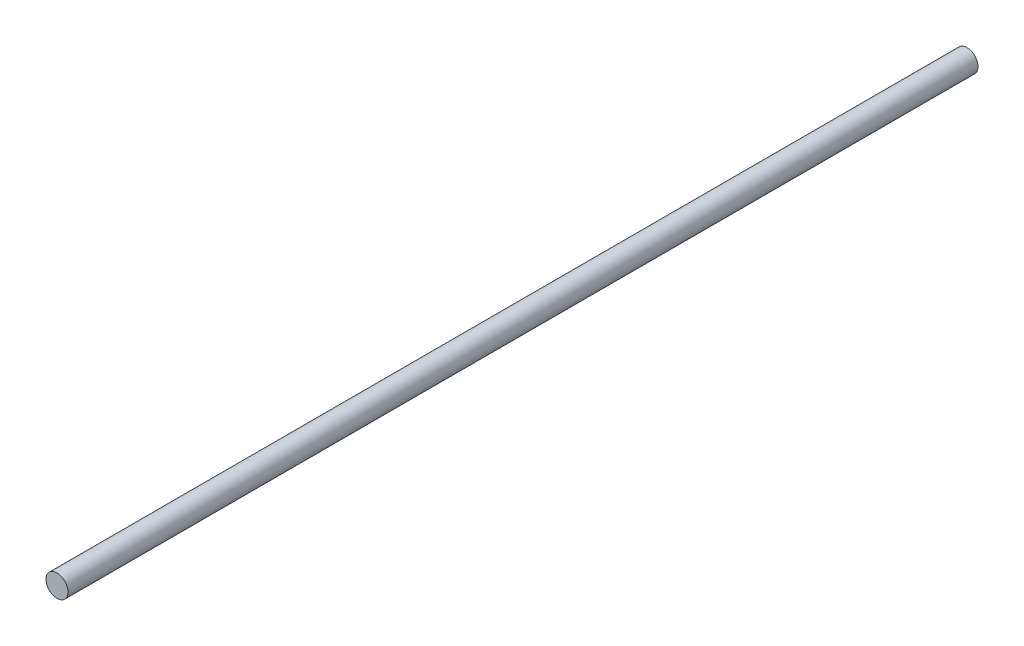
ISO-10303-21;
HEADER;
FILE_DESCRIPTION(('STEP AP214'),'2;1');
FILE_NAME('part.step','',(''),(''),'','','');
FILE_SCHEMA(('AUTOMOTIVE_DESIGN { 1 0 10303 214 1 1 1 1 }'));
ENDSEC;
DATA;
#1=APPLICATION_CONTEXT('core data for automotive mechanical design processes');
#2=APPLICATION_PROTOCOL_DEFINITION('international standard','automotive_design',2000,#1);
#3=PRODUCT_CONTEXT('',#1,'mechanical');
#4=PRODUCT('Part','Part','',(#3));
#5=PRODUCT_RELATED_PRODUCT_CATEGORY('part','',(#4));
#6=PRODUCT_DEFINITION_FORMATION('','',#4);
#7=PRODUCT_DEFINITION_CONTEXT('part definition',#1,'design');
#8=PRODUCT_DEFINITION('design','',#6,#7);
#9=PRODUCT_DEFINITION_SHAPE('','',#8);
#10=(LENGTH_UNIT() NAMED_UNIT(*) SI_UNIT(.MILLI.,.METRE.));
#11=(NAMED_UNIT(*) PLANE_ANGLE_UNIT() SI_UNIT($,.RADIAN.));
#12=(NAMED_UNIT(*) SI_UNIT($,.STERADIAN.) SOLID_ANGLE_UNIT());
#13=UNCERTAINTY_MEASURE_WITH_UNIT(LENGTH_MEASURE(1.E-05),#10,'distance_accuracy_value','');
#14=(GEOMETRIC_REPRESENTATION_CONTEXT(3) GLOBAL_UNCERTAINTY_ASSIGNED_CONTEXT((#13)) GLOBAL_UNIT_ASSIGNED_CONTEXT((#10,
#11,#12)) REPRESENTATION_CONTEXT('',''));
#15=CARTESIAN_POINT('',(0.,0.,0.));
#16=DIRECTION('',(0.,0.,1.));
#17=DIRECTION('',(1.,0.,0.));
#18=AXIS2_PLACEMENT_3D('',#15,#16,#17);
#19=CARTESIAN_POINT('',(0.,0.,165.));
#20=DIRECTION('',(0.,0.,-1.));
#21=DIRECTION('',(-1.,0.,0.));
#22=AXIS2_PLACEMENT_3D('',#19,#20,#21);
#23=CYLINDRICAL_SURFACE('',#22,4.);
#24=CARTESIAN_POINT('',(0.,0.,165.));
#25=DIRECTION('',(0.,0.,1.));
#26=DIRECTION('',(1.,0.,0.));
#27=AXIS2_PLACEMENT_3D('',#24,#25,#26);
#28=CIRCLE('',#27,4.);
#29=CARTESIAN_POINT('',(4.,0.,165.));
#30=VERTEX_POINT('',#29);
#31=EDGE_CURVE('E10',#30,#30,#28,.T.);
#32=ORIENTED_EDGE('',*,*,#31,.F.);
#33=EDGE_LOOP('',(#32));
#34=FACE_BOUND('',#33,.T.);
#35=CARTESIAN_POINT('',(0.,0.,-165.));
#36=DIRECTION('',(0.,0.,1.));
#37=DIRECTION('',(1.,0.,0.));
#38=AXIS2_PLACEMENT_3D('',#35,#36,#37);
#39=CIRCLE('',#38,4.);
#40=CARTESIAN_POINT('',(4.,0.,-165.));
#41=VERTEX_POINT('',#40);
#42=EDGE_CURVE('E34',#41,#41,#39,.T.);
#43=ORIENTED_EDGE('',*,*,#42,.T.);
#44=EDGE_LOOP('',(#43));
#45=FACE_BOUND('',#44,.T.);
#46=ADVANCED_FACE('F31',(#34,#45),#23,.T.);
#47=CARTESIAN_POINT('',(0.,0.,165.));
#48=DIRECTION('',(0.,0.,1.));
#49=DIRECTION('',(1.,0.,0.));
#50=AXIS2_PLACEMENT_3D('',#47,#48,#49);
#51=PLANE('',#50);
#52=ORIENTED_EDGE('',*,*,#31,.T.);
#53=EDGE_LOOP('',(#52));
#54=FACE_BOUND('',#53,.T.);
#55=ADVANCED_FACE('F46',(#54),#51,.T.);
#56=CARTESIAN_POINT('',(0.,0.,-165.));
#57=DIRECTION('',(0.,0.,1.));
#58=DIRECTION('',(1.,0.,0.));
#59=AXIS2_PLACEMENT_3D('',#56,#57,#58);
#60=PLANE('',#59);
#61=ORIENTED_EDGE('',*,*,#42,.F.);
#62=EDGE_LOOP('',(#61));
#63=FACE_BOUND('',#62,.T.);
#64=ADVANCED_FACE('F44',(#63),#60,.F.);
#65=CLOSED_SHELL('',(#46,#55,#64));
#66=MANIFOLD_SOLID_BREP('B2',#65);
#67=ADVANCED_BREP_SHAPE_REPRESENTATION('',(#18,#66),#14);
#68=SHAPE_DEFINITION_REPRESENTATION(#9,#67);
ENDSEC;
END-ISO-10303-21;
